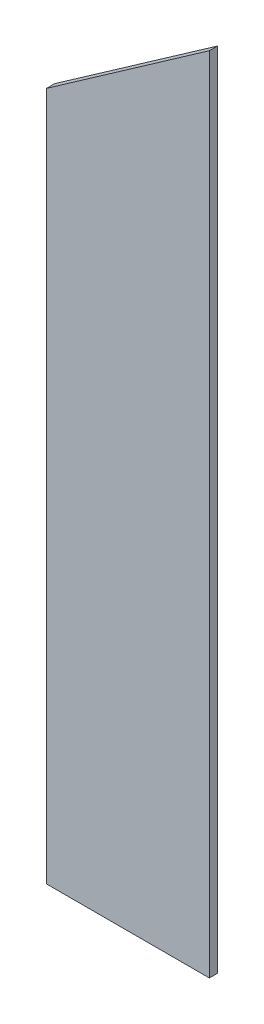
ISO-10303-21;
HEADER;
FILE_DESCRIPTION(('STEP AP214'),'2;1');
FILE_NAME('part.step','',(''),(''),'','','');
FILE_SCHEMA(('AUTOMOTIVE_DESIGN { 1 0 10303 214 1 1 1 1 }'));
ENDSEC;
DATA;
#1=APPLICATION_CONTEXT('core data for automotive mechanical design processes');
#2=APPLICATION_PROTOCOL_DEFINITION('international standard','automotive_design',2000,#1);
#3=PRODUCT_CONTEXT('',#1,'mechanical');
#4=PRODUCT('Part','Part','',(#3));
#5=PRODUCT_RELATED_PRODUCT_CATEGORY('part','',(#4));
#6=PRODUCT_DEFINITION_FORMATION('','',#4);
#7=PRODUCT_DEFINITION_CONTEXT('part definition',#1,'design');
#8=PRODUCT_DEFINITION('design','',#6,#7);
#9=PRODUCT_DEFINITION_SHAPE('','',#8);
#10=(LENGTH_UNIT() NAMED_UNIT(*) SI_UNIT(.MILLI.,.METRE.));
#11=(NAMED_UNIT(*) PLANE_ANGLE_UNIT() SI_UNIT($,.RADIAN.));
#12=(NAMED_UNIT(*) SI_UNIT($,.STERADIAN.) SOLID_ANGLE_UNIT());
#13=UNCERTAINTY_MEASURE_WITH_UNIT(LENGTH_MEASURE(1.E-05),#10,'distance_accuracy_value','');
#14=(GEOMETRIC_REPRESENTATION_CONTEXT(3) GLOBAL_UNCERTAINTY_ASSIGNED_CONTEXT((#13)) GLOBAL_UNIT_ASSIGNED_CONTEXT((#10,
#11,#12)) REPRESENTATION_CONTEXT('',''));
#15=CARTESIAN_POINT('',(0.,0.,0.));
#16=DIRECTION('',(0.,0.,1.));
#17=DIRECTION('',(1.,0.,0.));
#18=AXIS2_PLACEMENT_3D('',#15,#16,#17);
#19=CARTESIAN_POINT('',(-50.,422.98,5.));
#20=DIRECTION('',(-0.573576436351047,0.819152044288991,0.));
#21=DIRECTION('',(-0.819152044288991,-0.573576436351047,0.));
#22=AXIS2_PLACEMENT_3D('',#19,#20,#21);
#23=PLANE('',#22);
#24=DIRECTION('',(0.819152044288991,0.573576436351047,0.));
#25=VECTOR('',#24,1.);
#26=CARTESIAN_POINT('',(-50.,422.98,0.));
#27=LINE('',#26,#25);
#28=CARTESIAN_POINT('',(-50.,422.98,0.));
#29=VERTEX_POINT('',#28);
#30=CARTESIAN_POINT('',(50.,493.000753820971,0.));
#31=VERTEX_POINT('',#30);
#32=EDGE_CURVE('E101',#29,#31,#27,.T.);
#33=ORIENTED_EDGE('',*,*,#32,.F.);
#34=DIRECTION('',(0.,0.,-1.));
#35=VECTOR('',#34,1.);
#36=CARTESIAN_POINT('',(-50.,422.98,5.));
#37=LINE('',#36,#35);
#38=CARTESIAN_POINT('',(-50.,422.98,5.));
#39=VERTEX_POINT('',#38);
#40=EDGE_CURVE('E11',#39,#29,#37,.T.);
#41=ORIENTED_EDGE('',*,*,#40,.F.);
#42=DIRECTION('',(0.819152044288991,0.573576436351047,0.));
#43=VECTOR('',#42,1.);
#44=CARTESIAN_POINT('',(-50.,422.98,5.));
#45=LINE('',#44,#43);
#46=CARTESIAN_POINT('',(50.,493.000753820971,5.));
#47=VERTEX_POINT('',#46);
#48=EDGE_CURVE('E84',#39,#47,#45,.T.);
#49=ORIENTED_EDGE('',*,*,#48,.T.);
#50=DIRECTION('',(0.,0.,-1.));
#51=VECTOR('',#50,1.);
#52=CARTESIAN_POINT('',(50.,493.000753820971,5.));
#53=LINE('',#52,#51);
#54=EDGE_CURVE('E36',#47,#31,#53,.T.);
#55=ORIENTED_EDGE('',*,*,#54,.T.);
#56=EDGE_LOOP('',(#33,#41,#49,#55));
#57=FACE_BOUND('',#56,.T.);
#58=ADVANCED_FACE('F33',(#57),#23,.T.);
#59=CARTESIAN_POINT('',(-50.,422.98,5.));
#60=DIRECTION('',(1.,0.,0.));
#61=DIRECTION('',(0.,1.,0.));
#62=AXIS2_PLACEMENT_3D('',#59,#60,#61);
#63=PLANE('',#62);
#64=DIRECTION('',(0.,-1.,0.));
#65=VECTOR('',#64,1.);
#66=CARTESIAN_POINT('',(-50.,422.98,0.));
#67=LINE('',#66,#65);
#68=CARTESIAN_POINT('',(-50.0000000000001,0.,0.));
#69=VERTEX_POINT('',#68);
#70=EDGE_CURVE('E66',#29,#69,#67,.T.);
#71=ORIENTED_EDGE('',*,*,#70,.T.);
#72=DIRECTION('',(0.,0.,-1.));
#73=VECTOR('',#72,1.);
#74=CARTESIAN_POINT('',(-50.0000000000001,0.,5.));
#75=LINE('',#74,#73);
#76=CARTESIAN_POINT('',(-50.0000000000001,0.,5.));
#77=VERTEX_POINT('',#76);
#78=EDGE_CURVE('E42',#77,#69,#75,.T.);
#79=ORIENTED_EDGE('',*,*,#78,.F.);
#80=DIRECTION('',(0.,-1.,0.));
#81=VECTOR('',#80,1.);
#82=CARTESIAN_POINT('',(-50.,422.98,5.));
#83=LINE('',#82,#81);
#84=EDGE_CURVE('E88',#39,#77,#83,.T.);
#85=ORIENTED_EDGE('',*,*,#84,.F.);
#86=ORIENTED_EDGE('',*,*,#40,.T.);
#87=EDGE_LOOP('',(#71,#79,#85,#86));
#88=FACE_BOUND('',#87,.T.);
#89=ADVANCED_FACE('F115',(#88),#63,.F.);
#90=CARTESIAN_POINT('',(-50.0000000000001,0.,5.));
#91=DIRECTION('',(0.,1.,0.));
#92=DIRECTION('',(0.,0.,1.));
#93=AXIS2_PLACEMENT_3D('',#90,#91,#92);
#94=PLANE('',#93);
#95=DIRECTION('',(1.,0.,0.));
#96=VECTOR('',#95,1.);
#97=CARTESIAN_POINT('',(-50.0000000000001,0.,0.));
#98=LINE('',#97,#96);
#99=CARTESIAN_POINT('',(50.0000000000001,0.,0.));
#100=VERTEX_POINT('',#99);
#101=EDGE_CURVE('E93',#69,#100,#98,.T.);
#102=ORIENTED_EDGE('',*,*,#101,.T.);
#103=DIRECTION('',(0.,0.,-1.));
#104=VECTOR('',#103,1.);
#105=CARTESIAN_POINT('',(50.0000000000001,0.,5.));
#106=LINE('',#105,#104);
#107=CARTESIAN_POINT('',(50.0000000000001,0.,5.));
#108=VERTEX_POINT('',#107);
#109=EDGE_CURVE('E79',#108,#100,#106,.T.);
#110=ORIENTED_EDGE('',*,*,#109,.F.);
#111=DIRECTION('',(1.,0.,0.));
#112=VECTOR('',#111,1.);
#113=CARTESIAN_POINT('',(-50.0000000000001,0.,5.));
#114=LINE('',#113,#112);
#115=EDGE_CURVE('E83',#77,#108,#114,.T.);
#116=ORIENTED_EDGE('',*,*,#115,.F.);
#117=ORIENTED_EDGE('',*,*,#78,.T.);
#118=EDGE_LOOP('',(#102,#110,#116,#117));
#119=FACE_BOUND('',#118,.T.);
#120=ADVANCED_FACE('F91',(#119),#94,.F.);
#121=CARTESIAN_POINT('',(50.,422.98,5.));
#122=DIRECTION('',(1.,0.,0.));
#123=DIRECTION('',(0.,1.,0.));
#124=AXIS2_PLACEMENT_3D('',#121,#122,#123);
#125=PLANE('',#124);
#126=DIRECTION('',(0.,-1.,0.));
#127=VECTOR('',#126,1.);
#128=CARTESIAN_POINT('',(50.,422.98,0.));
#129=LINE('',#128,#127);
#130=EDGE_CURVE('E99',#31,#100,#129,.T.);
#131=ORIENTED_EDGE('',*,*,#130,.F.);
#132=ORIENTED_EDGE('',*,*,#54,.F.);
#133=DIRECTION('',(0.,-1.,0.));
#134=VECTOR('',#133,1.);
#135=CARTESIAN_POINT('',(50.,493.000753820971,5.));
#136=LINE('',#135,#134);
#137=EDGE_CURVE('E75',#47,#108,#136,.T.);
#138=ORIENTED_EDGE('',*,*,#137,.T.);
#139=ORIENTED_EDGE('',*,*,#109,.T.);
#140=EDGE_LOOP('',(#131,#132,#138,#139));
#141=FACE_BOUND('',#140,.T.);
#142=ADVANCED_FACE('F77',(#141),#125,.T.);
#143=CARTESIAN_POINT('',(0.,0.,5.));
#144=DIRECTION('',(0.,0.,-1.));
#145=DIRECTION('',(-1.,0.,0.));
#146=AXIS2_PLACEMENT_3D('',#143,#144,#145);
#147=PLANE('',#146);
#148=ORIENTED_EDGE('',*,*,#48,.F.);
#149=ORIENTED_EDGE('',*,*,#84,.T.);
#150=ORIENTED_EDGE('',*,*,#115,.T.);
#151=ORIENTED_EDGE('',*,*,#137,.F.);
#152=EDGE_LOOP('',(#148,#149,#150,#151));
#153=FACE_BOUND('',#152,.T.);
#154=ADVANCED_FACE('F87',(#153),#147,.F.);
#155=CARTESIAN_POINT('',(0.,0.,0.));
#156=DIRECTION('',(0.,0.,-1.));
#157=DIRECTION('',(-1.,0.,0.));
#158=AXIS2_PLACEMENT_3D('',#155,#156,#157);
#159=PLANE('',#158);
#160=ORIENTED_EDGE('',*,*,#32,.T.);
#161=ORIENTED_EDGE('',*,*,#130,.T.);
#162=ORIENTED_EDGE('',*,*,#101,.F.);
#163=ORIENTED_EDGE('',*,*,#70,.F.);
#164=EDGE_LOOP('',(#160,#161,#162,#163));
#165=FACE_BOUND('',#164,.T.);
#166=ADVANCED_FACE('F106',(#165),#159,.T.);
#167=CLOSED_SHELL('',(#58,#89,#120,#142,#154,#166));
#168=MANIFOLD_SOLID_BREP('B2',#167);
#169=ADVANCED_BREP_SHAPE_REPRESENTATION('',(#18,#168),#14);
#170=SHAPE_DEFINITION_REPRESENTATION(#9,#169);
ENDSEC;
END-ISO-10303-21;
